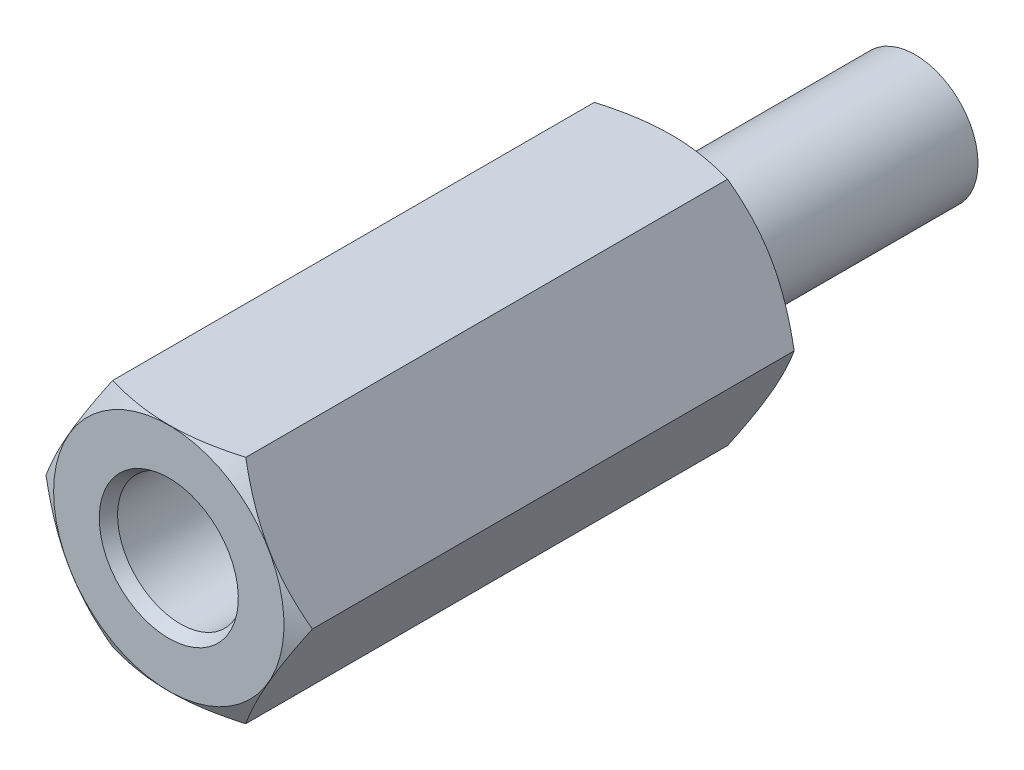
ISO-10303-21;
HEADER;
FILE_DESCRIPTION(('STEP AP214'),'2;1');
FILE_NAME('part.step','',(''),(''),'','','');
FILE_SCHEMA(('AUTOMOTIVE_DESIGN { 1 0 10303 214 1 1 1 1 }'));
ENDSEC;
DATA;
#1=APPLICATION_CONTEXT('core data for automotive mechanical design processes');
#2=APPLICATION_PROTOCOL_DEFINITION('international standard','automotive_design',2000,#1);
#3=PRODUCT_CONTEXT('',#1,'mechanical');
#4=PRODUCT('Part','Part','',(#3));
#5=PRODUCT_RELATED_PRODUCT_CATEGORY('part','',(#4));
#6=PRODUCT_DEFINITION_FORMATION('','',#4);
#7=PRODUCT_DEFINITION_CONTEXT('part definition',#1,'design');
#8=PRODUCT_DEFINITION('design','',#6,#7);
#9=PRODUCT_DEFINITION_SHAPE('','',#8);
#10=(LENGTH_UNIT() NAMED_UNIT(*) SI_UNIT(.MILLI.,.METRE.));
#11=(NAMED_UNIT(*) PLANE_ANGLE_UNIT() SI_UNIT($,.RADIAN.));
#12=(NAMED_UNIT(*) SI_UNIT($,.STERADIAN.) SOLID_ANGLE_UNIT());
#13=UNCERTAINTY_MEASURE_WITH_UNIT(LENGTH_MEASURE(1.E-05),#10,'distance_accuracy_value','');
#14=(GEOMETRIC_REPRESENTATION_CONTEXT(3) GLOBAL_UNCERTAINTY_ASSIGNED_CONTEXT((#13)) GLOBAL_UNIT_ASSIGNED_CONTEXT((#10,
#11,#12)) REPRESENTATION_CONTEXT('',''));
#15=CARTESIAN_POINT('',(0.,0.,0.));
#16=DIRECTION('',(0.,0.,1.));
#17=DIRECTION('',(1.,0.,0.));
#18=AXIS2_PLACEMENT_3D('',#15,#16,#17);
#19=CARTESIAN_POINT('',(0.,0.,5.99999999997181));
#20=DIRECTION('',(0.,0.,1.));
#21=DIRECTION('',(1.,0.,0.));
#22=AXIS2_PLACEMENT_3D('',#19,#20,#21);
#23=CONICAL_SURFACE('',#22,1.50000000002137,1.0471975511292);
#24=CARTESIAN_POINT('',(0.,0.,6.));
#25=DIRECTION('',(0.,0.,-1.));
#26=DIRECTION('',(-1.,0.,0.));
#27=AXIS2_PLACEMENT_3D('',#24,#25,#26);
#28=CIRCLE('',#27,1.5);
#29=CARTESIAN_POINT('',(-1.5,0.,6.));
#30=VERTEX_POINT('',#29);
#31=EDGE_CURVE('E245',#30,#30,#28,.F.);
#32=ORIENTED_EDGE('',*,*,#31,.T.);
#33=EDGE_LOOP('',(#32));
#34=FACE_BOUND('',#33,.T.);
#35=CARTESIAN_POINT('',(-1.13686837721616E-10,0.,5.13397459610587));
#36=VERTEX_POINT('',#35);
#37=VERTEX_LOOP('',#36);
#38=FACE_BOUND('',#37,.T.);
#39=ADVANCED_FACE('F16',(#34,#38),#23,.F.);
#40=CARTESIAN_POINT('',(0.,0.,11.722871870789));
#41=DIRECTION('',(0.,0.,-1.));
#42=DIRECTION('',(-1.,0.,0.));
#43=AXIS2_PLACEMENT_3D('',#40,#41,#42);
#44=CYLINDRICAL_SURFACE('',#43,1.5);
#45=ORIENTED_EDGE('',*,*,#31,.F.);
#46=EDGE_LOOP('',(#45));
#47=FACE_BOUND('',#46,.T.);
#48=CARTESIAN_POINT('',(0.,0.,11.722871870802));
#49=DIRECTION('',(0.,0.,1.));
#50=DIRECTION('',(1.,0.,0.));
#51=AXIS2_PLACEMENT_3D('',#48,#49,#50);
#52=CIRCLE('',#51,1.50000000007822);
#53=CARTESIAN_POINT('',(1.50000000007822,0.,11.722871870802));
#54=VERTEX_POINT('',#53);
#55=EDGE_CURVE('E248',#54,#54,#52,.T.);
#56=ORIENTED_EDGE('',*,*,#55,.T.);
#57=EDGE_LOOP('',(#56));
#58=FACE_BOUND('',#57,.T.);
#59=ADVANCED_FACE('F75',(#47,#58),#44,.F.);
#60=CARTESIAN_POINT('',(0.,0.,11.9999999998299));
#61=DIRECTION('',(0.,0.,1.));
#62=DIRECTION('',(0.,-1.,0.));
#63=AXIS2_PLACEMENT_3D('',#60,#61,#62);
#64=CONICAL_SURFACE('',#63,1.65999999995847,0.523598775560334);
#65=ORIENTED_EDGE('',*,*,#55,.F.);
#66=EDGE_LOOP('',(#65));
#67=FACE_BOUND('',#66,.T.);
#68=CARTESIAN_POINT('',(0.,0.,11.9999999998868));
#69=DIRECTION('',(0.,0.,1.));
#70=DIRECTION('',(0.,-1.,0.));
#71=AXIS2_PLACEMENT_3D('',#68,#69,#70);
#72=CIRCLE('',#71,1.65999999999129);
#73=CARTESIAN_POINT('',(0.,-1.65999999999129,11.9999999998868));
#74=VERTEX_POINT('',#73);
#75=EDGE_CURVE('E19',#74,#74,#72,.F.);
#76=ORIENTED_EDGE('',*,*,#75,.F.);
#77=EDGE_LOOP('',(#76));
#78=FACE_BOUND('',#77,.T.);
#79=ADVANCED_FACE('F81',(#67,#78),#64,.F.);
#80=CARTESIAN_POINT('',(0.,0.,12.));
#81=DIRECTION('',(0.,0.,1.));
#82=DIRECTION('',(1.,0.,0.));
#83=AXIS2_PLACEMENT_3D('',#80,#81,#82);
#84=PLANE('',#83);
#85=ORIENTED_EDGE('',*,*,#75,.T.);
#86=EDGE_LOOP('',(#85));
#87=FACE_BOUND('',#86,.T.);
#88=CARTESIAN_POINT('',(0.,0.,12.0000000000005));
#89=DIRECTION('',(0.,0.,-1.));
#90=DIRECTION('',(-1.,0.,0.));
#91=AXIS2_PLACEMENT_3D('',#88,#89,#90);
#92=CIRCLE('',#91,2.74999999999181);
#93=CARTESIAN_POINT('',(-2.74999999999181,0.,12.0000000000005));
#94=VERTEX_POINT('',#93);
#95=EDGE_CURVE('E292',#94,#94,#92,.T.);
#96=ORIENTED_EDGE('',*,*,#95,.F.);
#97=EDGE_LOOP('',(#96));
#98=FACE_BOUND('',#97,.T.);
#99=ADVANCED_FACE('F180',(#87,#98),#84,.T.);
#100=CARTESIAN_POINT('',(0.,0.,11.7502498205226));
#101=DIRECTION('',(0.,0.,-1.));
#102=DIRECTION('',(-1.,0.,0.));
#103=AXIS2_PLACEMENT_3D('',#100,#101,#102);
#104=CONICAL_SURFACE('',#103,3.18258000004334,1.0471975511931);
#105=ORIENTED_EDGE('',*,*,#95,.T.);
#106=EDGE_LOOP('',(#105));
#107=FACE_BOUND('',#106,.T.);
#108=CARTESIAN_POINT('',(-1.59000000000081,2.7539607840336,11.7517393842424));
#109=CARTESIAN_POINT('',(-1.6598708706135,2.63294088616341,11.7920910440021));
#110=CARTESIAN_POINT('',(-1.73034486558733,2.51087634625645,11.828788766705));
#111=CARTESIAN_POINT('',(-1.8725130656166,2.26463380058525,11.8928435394925));
#112=CARTESIAN_POINT('',(-1.94420979590354,2.14045142099178,11.9201779318999));
#113=CARTESIAN_POINT('',(-2.08671475483976,1.89362559178385,11.9627258843608));
#114=CARTESIAN_POINT('',(-2.1575010634166,1.77102010884858,11.9782226576371));
#115=CARTESIAN_POINT('',(-2.299406579769,1.52523254465205,11.9967191112558));
#116=CARTESIAN_POINT('',(-2.37052527211051,1.40205135614876,11.9997341119358));
#117=CARTESIAN_POINT('',(-2.50340291932097,1.17190051999014,11.9934458608386));
#118=CARTESIAN_POINT('',(-2.56518181356342,1.06489633632685,11.9856865831297));
#119=CARTESIAN_POINT('',(-2.68833713270422,0.851585066352739,11.9610991999038));
#120=CARTESIAN_POINT('',(-2.74971313195913,0.745278717277973,11.9442627036052));
#121=CARTESIAN_POINT('',(-2.8731221626718,0.531528005970905,11.9021747215607));
#122=CARTESIAN_POINT('',(-2.93513958293056,0.424110683128436,11.8767449108493));
#123=CARTESIAN_POINT('',(-3.05824970115422,0.210877703439366,11.8190299913591));
#124=CARTESIAN_POINT('',(-3.11934397508537,0.105059316939125,11.7867584345848));
#125=CARTESIAN_POINT('',(-3.18,1.88357274513719E-12,11.7517393842422));
#126=B_SPLINE_CURVE_WITH_KNOTS('',3,(#108,#109,#110,#111,#112,#113,#114,#115,#116,#117,#118,
#119,#120,#121,#122,#123,#124,#125),.UNSPECIFIED.,.F.,.F.,(4,2,2,2,2,2,2,2,4),(0.,
0.43652483186984,0.874098639021207,1.3008438498636,1.72706511088042,2.09811573984899,
2.469509949424,2.84913990286461,3.22802480296586),.UNSPECIFIED.);
#127=CARTESIAN_POINT('',(-1.5899999999996,2.7539607840343,11.7517393842424));
#128=VERTEX_POINT('',#127);
#129=CARTESIAN_POINT('',(-3.17999999999971,4.45101924340833E-13,11.7517393842424));
#130=VERTEX_POINT('',#129);
#131=EDGE_CURVE('E166',#128,#130,#126,.T.);
#132=ORIENTED_EDGE('',*,*,#131,.T.);
#133=CARTESIAN_POINT('',(-3.17999999999943,-9.93263192367112E-13,11.7517393842425));
#134=CARTESIAN_POINT('',(-3.11012912938674,-0.121019897871171,11.7920910440022));
#135=CARTESIAN_POINT('',(-3.03965513441292,-0.243084437778119,11.8287887667052));
#136=CARTESIAN_POINT('',(-2.89748693438367,-0.489326983449281,11.8928435394927));
#137=CARTESIAN_POINT('',(-2.82579020409674,-0.613509363042745,11.9201779319001));
#138=CARTESIAN_POINT('',(-2.68328524516053,-0.860335192250644,11.9627258843611));
#139=CARTESIAN_POINT('',(-2.6124989365837,-0.982940675185901,11.9782226576375));
#140=CARTESIAN_POINT('',(-2.47059342023131,-1.22872823938241,11.9967191112563));
#141=CARTESIAN_POINT('',(-2.39947472788981,-1.35190942788568,11.9997341119363));
#142=CARTESIAN_POINT('',(-2.26659708067932,-1.58206026404435,11.9934458608392));
#143=CARTESIAN_POINT('',(-2.20481818643684,-1.6890644477077,11.9856865831303));
#144=CARTESIAN_POINT('',(-2.08166286729598,-1.90237571768192,11.9610991999045));
#145=CARTESIAN_POINT('',(-2.02028686804103,-2.00868206675674,11.9442627036058));
#146=CARTESIAN_POINT('',(-1.89687783732829,-2.22243277806393,11.9021747215614));
#147=CARTESIAN_POINT('',(-1.8348604170695,-2.32985010090646,11.87674491085));
#148=CARTESIAN_POINT('',(-1.71175029884578,-2.54308308059564,11.8190299913598));
#149=CARTESIAN_POINT('',(-1.65065602491459,-2.64890146709594,11.7867584345855));
#150=CARTESIAN_POINT('',(-1.58999999999993,-2.75396078403324,11.7517393842428));
#151=B_SPLINE_CURVE_WITH_KNOTS('',3,(#133,#134,#135,#136,#137,#138,#139,#140,#141,#142,#143,
#144,#145,#146,#147,#148,#149,#150),.UNSPECIFIED.,.F.,.F.,(4,2,2,2,2,2,2,2,4),(0.,
0.436524831869811,0.874098639021153,1.30084384986351,1.7270651108803,2.09811573984906,
2.46950994942426,2.84913990286507,3.22802480296652),.UNSPECIFIED.);
#152=CARTESIAN_POINT('',(-1.58999999999893,-2.75396078403412,11.7517393842427));
#153=VERTEX_POINT('',#152);
#154=EDGE_CURVE('E156',#130,#153,#151,.T.);
#155=ORIENTED_EDGE('',*,*,#154,.T.);
#156=CARTESIAN_POINT('',(-1.58999999999793,-2.753960784035,11.7517393842425));
#157=CARTESIAN_POINT('',(-1.45025825877261,-2.753960784035,11.7920910440022));
#158=CARTESIAN_POINT('',(-1.30931026882502,-2.753960784035,11.8287887667051));
#159=CARTESIAN_POINT('',(-1.0249738687666,-2.753960784035,11.8928435394926));
#160=CARTESIAN_POINT('',(-0.881580408192781,-2.753960784035,11.9201779319));
#161=CARTESIAN_POINT('',(-0.596570490320465,-2.753960784035,11.9627258843609));
#162=CARTESIAN_POINT('',(-0.454997873166852,-2.753960784035,11.9782226576371));
#163=CARTESIAN_POINT('',(-0.171186840462178,-2.753960784035,11.9967191112559));
#164=CARTESIAN_POINT('',(-0.0289494557792292,-2.753960784035,11.9997341119358));
#165=CARTESIAN_POINT('',(0.236805838641543,-2.753960784035,11.9934458608386));
#166=CARTESIAN_POINT('',(0.360363627126348,-2.753960784035,11.9856865831298));
#167=CARTESIAN_POINT('',(0.606674265407746,-2.753960784035,11.9610991999039));
#168=CARTESIAN_POINT('',(0.729426263917479,-2.753960784035,11.9442627036052));
#169=CARTESIAN_POINT('',(0.97624432534263,-2.753960784035,11.9021747215607));
#170=CARTESIAN_POINT('',(1.10027916586005,-2.753960784035,11.8767449108494));
#171=CARTESIAN_POINT('',(1.34649940230717,-2.753960784035,11.8190299913592));
#172=CARTESIAN_POINT('',(1.46868795016939,-2.753960784035,11.786758434585));
#173=CARTESIAN_POINT('',(1.58999999999855,-2.753960784035,11.7517393842424));
#174=B_SPLINE_CURVE_WITH_KNOTS('',3,(#156,#157,#158,#159,#160,#161,#162,#163,#164,#165,#166,
#167,#168,#169,#170,#171,#172,#173),.UNSPECIFIED.,.F.,.F.,(4,2,2,2,2,2,2,2,4),(0.,
0.436524831869808,0.874098639021144,1.30084384986351,1.7270651108803,2.09811573984873,
2.46950994942359,2.84913990286404,3.22802480296514),.UNSPECIFIED.);
#175=CARTESIAN_POINT('',(1.58999999999976,-2.75396078403416,11.7517393842424));
#176=VERTEX_POINT('',#175);
#177=EDGE_CURVE('E70',#153,#176,#174,.T.);
#178=ORIENTED_EDGE('',*,*,#177,.T.);
#179=CARTESIAN_POINT('',(1.59000000000097,-2.75396078403333,11.7517393842425));
#180=CARTESIAN_POINT('',(1.65987087061185,-2.63294088616626,11.7920910440011));
#181=CARTESIAN_POINT('',(1.73034486558385,-2.51087634626247,11.8287887667032));
#182=CARTESIAN_POINT('',(1.87251306560918,-2.2646338005981,11.8928435394894));
#183=CARTESIAN_POINT('',(1.944209795894,-2.14045142100829,11.9201779318964));
#184=CARTESIAN_POINT('',(2.0867147548299,-1.89362559180093,11.9627258843585));
#185=CARTESIAN_POINT('',(2.15750106340858,-1.77102010886247,11.9782226576357));
#186=CARTESIAN_POINT('',(2.299406579765,-1.52523254465898,11.9967191112556));
#187=CARTESIAN_POINT('',(2.37052527210869,-1.40205135615192,11.9997341119357));
#188=CARTESIAN_POINT('',(2.50340291885235,-1.17190052080182,11.9934458608609));
#189=CARTESIAN_POINT('',(2.56518181262683,-1.06489633794907,11.9856865832478));
#190=CARTESIAN_POINT('',(2.68833713083946,-0.851585069582595,11.9610992003451));
#191=CARTESIAN_POINT('',(2.7497131296342,-0.745278721304879,11.9442627042743));
#192=CARTESIAN_POINT('',(2.87312215941586,-0.531528011610361,11.9021747227978));
#193=CARTESIAN_POINT('',(2.93513957920425,-0.4241106895826,11.8767449124308));
#194=CARTESIAN_POINT('',(3.05824969650427,-0.210877711493303,11.8190299937042));
#195=CARTESIAN_POINT('',(3.11934396998211,-0.105059325778235,11.7867584373487));
#196=CARTESIAN_POINT('',(3.17999999444977,-9.61515524074901E-09,11.7517393874466));
#197=B_SPLINE_CURVE_WITH_KNOTS('',3,(#179,#180,#181,#182,#183,#184,#185,#186,#187,#188,#189,
#190,#191,#192,#193,#194,#195,#196),.UNSPECIFIED.,.F.,.F.,(4,2,2,2,2,2,2,2,4),(0.,
0.436524831858587,0.874098638997259,1.30084384985106,1.72706511088033,2.0981157370371,
2.46950994378989,2.84913989426173,3.22802479141682),.UNSPECIFIED.);
#198=CARTESIAN_POINT('',(3.17999999722489,-4.80757742682424E-09,11.7517393858444));
#199=VERTEX_POINT('',#198);
#200=EDGE_CURVE('E186',#176,#199,#197,.T.);
#201=ORIENTED_EDGE('',*,*,#200,.T.);
#202=CARTESIAN_POINT('',(3.17999999444915,9.61436255658718E-09,11.751739387447));
#203=CARTESIAN_POINT('',(3.11012912392832,0.121019907325435,11.7920910469445));
#204=CARTESIAN_POINT('',(3.03965512904694,0.243084447072275,11.8287887693687));
#205=CARTESIAN_POINT('',(2.89748692921154,0.489326992407661,11.8928435415773));
#206=CARTESIAN_POINT('',(2.82579019902609,0.613509371825361,11.9201779336848));
#207=CARTESIAN_POINT('',(2.68328524029266,0.860335200682049,11.962725885551));
#208=CARTESIAN_POINT('',(2.61249893181676,0.98294068344249,11.9782226585312));
#209=CARTESIAN_POINT('',(2.47059341567804,1.22872824726891,11.9967191115783));
#210=CARTESIAN_POINT('',(2.39947472344926,1.35190943557695,11.9997341119825));
#211=CARTESIAN_POINT('',(2.26659707671009,1.58206027091927,11.9934458604276));
#212=CARTESIAN_POINT('',(2.20481818282432,1.68906445396476,11.9856865825697));
#213=CARTESIAN_POINT('',(2.08166286439805,1.90237572270128,11.9610991991651));
#214=CARTESIAN_POINT('',(2.02028686550097,2.00868207115625,11.944262702837));
#215=CARTESIAN_POINT('',(1.8968778355167,2.2224327812017,11.9021747208437));
#216=CARTESIAN_POINT('',(1.83486041562823,2.32985010340281,11.8767449102168));
#217=CARTESIAN_POINT('',(1.71175029813376,2.5430830818289,11.8190299909836));
#218=CARTESIAN_POINT('',(1.65065602456152,2.64890146770747,11.7867584343814));
#219=CARTESIAN_POINT('',(1.59000000000017,2.75396078403283,11.751739384243));
#220=B_SPLINE_CURVE_WITH_KNOTS('',3,(#202,#203,#204,#205,#206,#207,#208,#209,#210,#211,#212,
#213,#214,#215,#216,#217,#218,#219),.UNSPECIFIED.,.F.,.F.,(4,2,2,2,2,2,2,2,4),(0.,
0.436524831121008,0.874098637504175,1.3008438476477,1.7270651079729,2.09811573484087,
2.46950994230716,2.84913989352475,3.22802479141719),.UNSPECIFIED.);
#221=CARTESIAN_POINT('',(1.58999999999917,2.75396078403391,11.7517393842427));
#222=VERTEX_POINT('',#221);
#223=EDGE_CURVE('E193',#199,#222,#220,.T.);
#224=ORIENTED_EDGE('',*,*,#223,.T.);
#225=CARTESIAN_POINT('',(1.58999999999818,2.753960784035,11.7517393842425));
#226=CARTESIAN_POINT('',(1.45025825877285,2.753960784035,11.7920910440021));
#227=CARTESIAN_POINT('',(1.30931026882525,2.753960784035,11.8287887667051));
#228=CARTESIAN_POINT('',(1.02497386876682,2.753960784035,11.8928435394925));
#229=CARTESIAN_POINT('',(0.881580408193001,2.753960784035,11.9201779318999));
#230=CARTESIAN_POINT('',(0.596570490320677,2.753960784035,11.9627258843608));
#231=CARTESIAN_POINT('',(0.454997873167059,2.753960784035,11.9782226576371));
#232=CARTESIAN_POINT('',(0.171186840462375,2.753960784035,11.9967191112559));
#233=CARTESIAN_POINT('',(0.0289494557794218,2.753960784035,11.9997341119358));
#234=CARTESIAN_POINT('',(-0.236805838641358,2.753960784035,11.9934458608386));
#235=CARTESIAN_POINT('',(-0.360363627126164,2.753960784035,11.9856865831298));
#236=CARTESIAN_POINT('',(-0.606674265407567,2.753960784035,11.9610991999039));
#237=CARTESIAN_POINT('',(-0.729426263917301,2.753960784035,11.9442627036052));
#238=CARTESIAN_POINT('',(-0.976244325342458,2.753960784035,11.9021747215608));
#239=CARTESIAN_POINT('',(-1.10027916585988,2.753960784035,11.8767449108494));
#240=CARTESIAN_POINT('',(-1.346499402307,2.753960784035,11.8190299913593));
#241=CARTESIAN_POINT('',(-1.46868795016923,2.753960784035,11.786758434585));
#242=CARTESIAN_POINT('',(-1.58999999999839,2.753960784035,11.7517393842424));
#243=B_SPLINE_CURVE_WITH_KNOTS('',3,(#225,#226,#227,#228,#229,#230,#231,#232,#233,#234,#235,
#236,#237,#238,#239,#240,#241,#242),.UNSPECIFIED.,.F.,.F.,(4,2,2,2,2,2,2,2,4),(0.,
0.436524831869825,0.874098639021177,1.30084384986355,1.72706511088036,2.0981157398488,
2.46950994942366,2.84913990286412,3.22802480296522),.UNSPECIFIED.);
#244=EDGE_CURVE('E198',#222,#128,#243,.T.);
#245=ORIENTED_EDGE('',*,*,#244,.T.);
#246=EDGE_LOOP('',(#132,#155,#178,#201,#224,#245));
#247=FACE_BOUND('',#246,.T.);
#248=ADVANCED_FACE('F175',(#107,#247),#104,.T.);
#249=CARTESIAN_POINT('',(1.59,-2.753960784035,-10.));
#250=DIRECTION('',(-0.866025403784329,0.50000000000019,0.));
#251=DIRECTION('',(-0.50000000000019,-0.866025403784329,0.));
#252=AXIS2_PLACEMENT_3D('',#249,#250,#251);
#253=PLANE('',#252);
#254=ORIENTED_EDGE('',*,*,#200,.F.);
#255=DIRECTION('',(0.,0.,1.));
#256=VECTOR('',#255,1.);
#257=CARTESIAN_POINT('',(1.59,-2.753960784035,-10.));
#258=LINE('',#257,#256);
#259=CARTESIAN_POINT('',(1.58999995668477,-2.753960784035,0.24826060327207));
#260=VERTEX_POINT('',#259);
#261=EDGE_CURVE('E165',#176,#260,#258,.F.);
#262=ORIENTED_EDGE('',*,*,#261,.T.);
#263=CARTESIAN_POINT('',(3.17999997396859,-1.38043565660934E-08,0.24826061880916));
#264=CARTESIAN_POINT('',(3.11012911256683,-0.121019915769744,0.207908953215328));
#265=CARTESIAN_POINT('',(3.03965512121165,-0.243084457633775,0.171211228361298));
#266=CARTESIAN_POINT('',(2.89748692355303,-0.489327005229111,0.107156454645271));
#267=CARTESIAN_POINT('',(2.82579019200708,-0.613509384783673,0.0798220634610996));
#268=CARTESIAN_POINT('',(2.68328523199397,-0.860335214278304,0.0372741127463411));
#269=CARTESIAN_POINT('',(2.61249892356692,-0.982940697525742,0.0217773399991891));
#270=CARTESIAN_POINT('',(2.47059340717891,-1.22872826219922,0.00328088774374463));
#271=CARTESIAN_POINT('',(2.39947471465223,-1.35190945086776,0.000265887901627008));
#272=CARTESIAN_POINT('',(2.26659706726036,-1.58206028724326,0.0065541405188458));
#273=CARTESIAN_POINT('',(2.20481817300529,-1.68906447096149,0.0143134189096583));
#274=CARTESIAN_POINT('',(2.081662853854,-1.90237574097821,0.0389008034590945));
#275=CARTESIAN_POINT('',(2.02028685460111,-2.00868209004078,0.0557373003974788));
#276=CARTESIAN_POINT('',(1.89687782385849,-2.22243280139259,0.0978252836647863));
#277=CARTESIAN_POINT('',(1.83486040356875,-2.32985012429052,0.123255094964128));
#278=CARTESIAN_POINT('',(1.71175028527326,-2.54308310410762,0.180970015555322));
#279=CARTESIAN_POINT('',(1.65065601130143,-2.64890149068009,0.213241572844589));
#280=CARTESIAN_POINT('',(1.58999998634231,-2.75396080769081,0.248260623661368));
#281=B_SPLINE_CURVE_WITH_KNOTS('',3,(#263,#264,#265,#266,#267,#268,#269,#270,#271,#272,#273,
#274,#275,#276,#277,#278,#279,#280),.UNSPECIFIED.,.F.,.F.,(4,2,2,2,2,2,2,2,4),(0.,
0.436524833133789,0.874098641209254,1.30084385252974,1.7270651141625,2.09811574343271,
2.46950995323602,2.8491399072231,3.22802480796484),.UNSPECIFIED.);
#282=CARTESIAN_POINT('',(3.17999998887964,-3.43587439187712E-13,0.248260609355515));
#283=VERTEX_POINT('',#282);
#284=EDGE_CURVE('E229',#283,#260,#281,.T.);
#285=ORIENTED_EDGE('',*,*,#284,.F.);
#286=DIRECTION('',(0.,0.,1.));
#287=VECTOR('',#286,1.);
#288=CARTESIAN_POINT('',(3.18,0.,-10.));
#289=LINE('',#288,#287);
#290=EDGE_CURVE('E221',#283,#199,#289,.T.);
#291=ORIENTED_EDGE('',*,*,#290,.T.);
#292=EDGE_LOOP('',(#254,#262,#285,#291));
#293=FACE_BOUND('',#292,.T.);
#294=ADVANCED_FACE('F179',(#293),#253,.F.);
#295=CARTESIAN_POINT('',(-1.59,-2.753960784035,-10.));
#296=DIRECTION('',(0.,1.,0.));
#297=DIRECTION('',(-1.,0.,0.));
#298=AXIS2_PLACEMENT_3D('',#295,#296,#297);
#299=PLANE('',#298);
#300=ORIENTED_EDGE('',*,*,#177,.F.);
#301=DIRECTION('',(0.,0.,1.));
#302=VECTOR('',#301,1.);
#303=CARTESIAN_POINT('',(-1.58999999999919,-2.75396078403453,-10.));
#304=LINE('',#303,#302);
#305=CARTESIAN_POINT('',(-1.58999999168347,-2.75396079843777,0.248260620576708));
#306=VERTEX_POINT('',#305);
#307=EDGE_CURVE('E164',#153,#306,#304,.F.);
#308=ORIENTED_EDGE('',*,*,#307,.T.);
#309=CARTESIAN_POINT('',(1.58999991336773,-2.75396078402463,0.248260590774307));
#310=CARTESIAN_POINT('',(1.45025817360475,-2.75396078403128,0.207908933064436));
#311=CARTESIAN_POINT('',(1.30931018512826,-2.753960784034,0.171211212541442));
#312=CARTESIAN_POINT('',(1.02497378815622,-2.753960784036,0.107156444280704));
#313=CARTESIAN_POINT('',(0.881580329198612,-2.75396078403527,0.0798220542172972));
#314=CARTESIAN_POINT('',(0.59657041449505,-2.75396078403474,0.0372741063897442));
#315=CARTESIAN_POINT('',(0.454997798887541,-2.75396078403493,0.0217773354170066));
#316=CARTESIAN_POINT('',(0.171186769454124,-2.75396078403507,0.00328088625075651));
#317=CARTESIAN_POINT('',(0.0289493864959698,-2.75396078403502,0.000265887721638831));
#318=CARTESIAN_POINT('',(-0.236805893284307,-2.75396078403499,0.00655414221770993));
#319=CARTESIAN_POINT('',(-0.360363668898581,-2.753960784035,0.0143134203425945));
#320=CARTESIAN_POINT('',(-0.606674281542169,-2.753960784035,0.0389008024412611));
#321=CARTESIAN_POINT('',(-0.729426267285031,-2.753960784035,0.0557372971921627));
#322=CARTESIAN_POINT('',(-0.976244302811604,-2.753960784035,0.0978252744052341));
#323=CARTESIAN_POINT('',(-1.10027913020865,-2.753960784035,0.123255081770787));
#324=CARTESIAN_POINT('',(-1.34649934086016,-2.753960784035,0.180969993297866));
#325=CARTESIAN_POINT('',(-1.46868787604557,-2.753960784035,0.213241545461235));
#326=CARTESIAN_POINT('',(-1.5899999133854,-2.753960784035,0.248260590772619));
#327=B_SPLINE_CURVE_WITH_KNOTS('',3,(#309,#310,#311,#312,#313,#314,#315,#316,#317,#318,#319,
#320,#321,#322,#323,#324,#325,#326),.UNSPECIFIED.,.F.,.F.,(4,2,2,2,2,2,2,2,4),(0.,
0.436524825940359,0.874098626999616,1.30084383247872,1.72706508819706,2.09811567883118,
2.46950984992722,2.84913976285341,3.22802462272753),.UNSPECIFIED.);
#328=EDGE_CURVE('E110',#260,#306,#327,.T.);
#329=ORIENTED_EDGE('',*,*,#328,.F.);
#330=ORIENTED_EDGE('',*,*,#261,.F.);
#331=EDGE_LOOP('',(#300,#308,#329,#330));
#332=FACE_BOUND('',#331,.T.);
#333=ADVANCED_FACE('F149',(#332),#299,.F.);
#334=CARTESIAN_POINT('',(-3.18,0.,-10.));
#335=DIRECTION('',(0.866025403784329,0.50000000000019,0.));
#336=DIRECTION('',(-0.50000000000019,0.866025403784329,0.));
#337=AXIS2_PLACEMENT_3D('',#334,#335,#336);
#338=PLANE('',#337);
#339=ORIENTED_EDGE('',*,*,#154,.F.);
#340=DIRECTION('',(0.,0.,1.));
#341=VECTOR('',#340,1.);
#342=CARTESIAN_POINT('',(-3.18000000000078,5.31259064517897E-13,-10.));
#343=LINE('',#342,#341);
#344=CARTESIAN_POINT('',(-3.1800000083235,-1.44148499172791E-08,0.248260620581433));
#345=VERTEX_POINT('',#344);
#346=EDGE_CURVE('E204',#130,#345,#343,.F.);
#347=ORIENTED_EDGE('',*,*,#346,.T.);
#348=CARTESIAN_POINT('',(-1.58999995415941,-2.75396078842243,0.248260648043194));
#349=CARTESIAN_POINT('',(-1.65987084500897,-2.63294090357003,0.207908972264785));
#350=CARTESIAN_POINT('',(-1.73034484908037,-2.51087636762512,0.17121124224218));
#351=CARTESIAN_POINT('',(-1.87251305740491,-2.26463382204411,0.107156462730054));
#352=CARTESIAN_POINT('',(-1.94420978686428,-2.14045143856239,0.0798220709214207));
#353=CARTESIAN_POINT('',(-2.08671474668205,-1.89362560404291,0.03727411799042));
#354=CARTESIAN_POINT('',(-2.15750105689917,-1.77102011963709,0.0217773436596175));
#355=CARTESIAN_POINT('',(-2.29940657592097,-1.52523255181265,0.00328088883448239));
#356=CARTESIAN_POINT('',(-2.3705252692927,-1.40205136115223,0.000265888010211152));
#357=CARTESIAN_POINT('',(-2.50340291401488,-1.17190052907007,0.00655413887387524));
#358=CARTESIAN_POINT('',(-2.56518180472514,-1.06489635160404,0.0143134157428545));
#359=CARTESIAN_POINT('',(-2.68833711679517,-0.851585093935437,0.0389007963174684));
#360=CARTESIAN_POINT('',(-2.74971311251183,-0.745278750968252,0.0557372907980576));
#361=CARTESIAN_POINT('',(-2.87312213620413,-0.531528051803749,0.0978252683882638));
#362=CARTESIAN_POINT('',(-2.93513955298304,-0.424110734992869,0.123255076448773));
#363=CARTESIAN_POINT('',(-3.05824966441623,-0.210877767073855,0.180969990117995));
#364=CARTESIAN_POINT('',(-3.11934393503576,-0.105059386313818,0.213241543730247));
#365=CARTESIAN_POINT('',(-3.17999995667977,-7.50328460800952E-08,0.248260590764907));
#366=B_SPLINE_CURVE_WITH_KNOTS('',3,(#348,#349,#350,#351,#352,#353,#354,#355,#356,#357,#358,
#359,#360,#361,#362,#363,#364,#365),.UNSPECIFIED.,.F.,.F.,(4,2,2,2,2,2,2,2,4),(0.,
0.436524840586926,0.874098655771885,1.30084387336796,1.72706514142679,2.098115748969,
2.46950993686252,2.84913986826758,3.22802474675772),.UNSPECIFIED.);
#367=EDGE_CURVE('E138',#306,#345,#366,.T.);
#368=ORIENTED_EDGE('',*,*,#367,.F.);
#369=ORIENTED_EDGE('',*,*,#307,.F.);
#370=EDGE_LOOP('',(#339,#347,#368,#369));
#371=FACE_BOUND('',#370,.T.);
#372=ADVANCED_FACE('F145',(#371),#338,.F.);
#373=CARTESIAN_POINT('',(-1.59,2.753960784035,-10.));
#374=DIRECTION('',(0.866025403784329,-0.50000000000019,0.));
#375=DIRECTION('',(0.50000000000019,0.866025403784329,0.));
#376=AXIS2_PLACEMENT_3D('',#373,#374,#375);
#377=PLANE('',#376);
#378=ORIENTED_EDGE('',*,*,#131,.F.);
#379=DIRECTION('',(0.,0.,1.));
#380=VECTOR('',#379,1.);
#381=CARTESIAN_POINT('',(-1.59,2.753960784035,-10.));
#382=LINE('',#381,#380);
#383=CARTESIAN_POINT('',(-1.59000001664482,2.753960784035,0.248260620581046));
#384=VERTEX_POINT('',#383);
#385=EDGE_CURVE('E203',#128,#384,#382,.F.);
#386=ORIENTED_EDGE('',*,*,#385,.T.);
#387=CARTESIAN_POINT('',(-3.1799999808862,-4.19193074839289E-08,0.248260648057505));
#388=CARTESIAN_POINT('',(-3.11012913167072,0.121019866970665,0.207908972274687));
#389=CARTESIAN_POINT('',(-3.03965514467866,0.243084412777128,0.171211242249771));
#390=CARTESIAN_POINT('',(-2.89748694887573,0.489326965589616,0.107156462734925));
#391=CARTESIAN_POINT('',(-2.82579021480654,0.613509346411201,0.0798220709258835));
#392=CARTESIAN_POINT('',(-2.68328525170972,0.860335179039908,0.0372741179936842));
#393=CARTESIAN_POINT('',(-2.61249894267919,0.982940664131842,0.0217773436620886));
#394=CARTESIAN_POINT('',(-2.47059342451877,1.22872823245582,0.00328088883562489));
#395=CARTESIAN_POINT('',(-2.3994747308237,1.35190942293072,0.000265888010819409));
#396=CARTESIAN_POINT('',(-2.26659708589632,1.58206025490149,0.00655413887373209));
#397=CARTESIAN_POINT('',(-2.20481819525222,1.68906443241161,0.0143134157428034));
#398=CARTESIAN_POINT('',(-2.08166288322785,1.90237569011829,0.0389007963183595));
#399=CARTESIAN_POINT('',(-2.02028688749061,2.00868203307941,0.0557372907997993));
#400=CARTESIAN_POINT('',(-1.89687786377839,2.22243273224426,0.0978252683923716));
#401=CARTESIAN_POINT('',(-1.8348604470006,2.32985004906183,0.123255076454424));
#402=CARTESIAN_POINT('',(-1.71175033556974,2.54308301699406,0.180969990127208));
#403=CARTESIAN_POINT('',(-1.6506560649514,2.64890139776063,0.213241543741478));
#404=CARTESIAN_POINT('',(-1.59000004329744,2.75396070904163,0.248260590778307));
#405=B_SPLINE_CURVE_WITH_KNOTS('',3,(#387,#388,#389,#390,#391,#392,#393,#394,#395,#396,#397,
#398,#399,#400,#401,#402,#403,#404),.UNSPECIFIED.,.F.,.F.,(4,2,2,2,2,2,2,2,4),(0.,
0.436524840590627,0.874098655779164,1.30084387337824,1.7270651414401,2.09811574899757,
2.46950993690637,2.8491398683277,3.22802474683404),.UNSPECIFIED.);
#406=EDGE_CURVE('E133',#345,#384,#405,.T.);
#407=ORIENTED_EDGE('',*,*,#406,.F.);
#408=ORIENTED_EDGE('',*,*,#346,.F.);
#409=EDGE_LOOP('',(#378,#386,#407,#408));
#410=FACE_BOUND('',#409,.T.);
#411=ADVANCED_FACE('F148',(#410),#377,.F.);
#412=CARTESIAN_POINT('',(1.59,2.753960784035,-10.));
#413=DIRECTION('',(0.,-1.,0.));
#414=DIRECTION('',(1.,0.,0.));
#415=AXIS2_PLACEMENT_3D('',#412,#413,#414);
#416=PLANE('',#415);
#417=ORIENTED_EDGE('',*,*,#244,.F.);
#418=DIRECTION('',(0.,0.,1.));
#419=VECTOR('',#418,1.);
#420=CARTESIAN_POINT('',(1.58999999999962,2.75396078403378,-10.));
#421=LINE('',#420,#419);
#422=CARTESIAN_POINT('',(1.58999999167576,2.75396079845113,0.248260620581163));
#423=VERTEX_POINT('',#422);
#424=EDGE_CURVE('E35',#222,#423,#421,.F.);
#425=ORIENTED_EDGE('',*,*,#424,.T.);
#426=CARTESIAN_POINT('',(-1.59000002674907,2.75396074654408,0.248260648043217));
#427=CARTESIAN_POINT('',(-1.45025828667795,2.75396077056994,0.207908972269668));
#428=CARTESIAN_POINT('',(-1.30931029561251,2.75396078042614,0.171211242248727));
#429=CARTESIAN_POINT('',(-1.02497389148458,2.75396078765254,0.107156462737));
#430=CARTESIAN_POINT('',(-0.881580427957533,2.75396078499268,0.0798220709271019));
#431=CARTESIAN_POINT('',(-0.596570505044809,2.75396078310103,0.0372741179941955));
#432=CARTESIAN_POINT('',(-0.454997885797533,2.75396078378603,0.0217773436627423));
#433=CARTESIAN_POINT('',(-0.17118684861633,2.75396078428366,0.00328088883605512));
#434=CARTESIAN_POINT('',(-0.0289494615501706,2.75396078409736,0.000265888010879106));
#435=CARTESIAN_POINT('',(0.236805828101963,2.75396078398072,0.00655413887305777));
#436=CARTESIAN_POINT('',(0.360363609459505,2.75396078402037,0.0143134157418955));
#437=CARTESIAN_POINT('',(0.606674233560255,2.75396078404965,0.038900796317091));
#438=CARTESIAN_POINT('',(0.72942622501733,2.75396078403922,0.0557372907984066));
#439=CARTESIAN_POINT('',(0.976244272428179,2.75396078403068,0.0978252683908277));
#440=CARTESIAN_POINT('',(1.10027910598803,2.75396078403284,0.123255076452847));
#441=CARTESIAN_POINT('',(1.34649932885823,2.75396078403715,0.180969990125639));
#442=CARTESIAN_POINT('',(1.46868787009911,2.7539607840393,0.213241543739947));
#443=CARTESIAN_POINT('',(1.58999991340004,2.753960784035,0.248260590776843));
#444=B_SPLINE_CURVE_WITH_KNOTS('',3,(#426,#427,#428,#429,#430,#431,#432,#433,#434,#435,#436,
#437,#438,#439,#440,#441,#442,#443),.UNSPECIFIED.,.F.,.F.,(4,2,2,2,2,2,2,2,4),(0.,
0.436524840586517,0.874098655771383,1.30084387336757,1.72706514142637,2.09811574898577,
2.46950993689662,2.84913986831964,3.22802474682752),.UNSPECIFIED.);
#445=EDGE_CURVE('E127',#384,#423,#444,.T.);
#446=ORIENTED_EDGE('',*,*,#445,.F.);
#447=ORIENTED_EDGE('',*,*,#385,.F.);
#448=EDGE_LOOP('',(#417,#425,#446,#447));
#449=FACE_BOUND('',#448,.T.);
#450=ADVANCED_FACE('F205',(#449),#416,.F.);
#451=CARTESIAN_POINT('',(3.18,0.,-10.));
#452=DIRECTION('',(-0.866025403784329,-0.50000000000019,0.));
#453=DIRECTION('',(0.50000000000019,-0.866025403784329,0.));
#454=AXIS2_PLACEMENT_3D('',#451,#452,#453);
#455=PLANE('',#454);
#456=ORIENTED_EDGE('',*,*,#223,.F.);
#457=ORIENTED_EDGE('',*,*,#290,.F.);
#458=CARTESIAN_POINT('',(1.58999995415297,2.75396078845778,0.248260648045046));
#459=CARTESIAN_POINT('',(1.6598708450064,2.63294090358316,0.207908972265066));
#460=CARTESIAN_POINT('',(1.73034484908541,2.51087636761873,0.171211242238986));
#461=CARTESIAN_POINT('',(1.87251305742997,2.26463382199839,0.107156462719694));
#462=CARTESIAN_POINT('',(1.94420978690178,2.14045143849682,0.079822070907546));
#463=CARTESIAN_POINT('',(2.08671474672182,1.89362560397463,0.0372741179811551));
#464=CARTESIAN_POINT('',(2.15750105692851,1.77102011958645,0.0217773436549312));
#465=CARTESIAN_POINT('',(2.29940657592782,1.52523255180063,0.00328088883445043));
#466=CARTESIAN_POINT('',(2.37052526928748,1.40205136116122,0.000265888010084223));
#467=CARTESIAN_POINT('',(2.50340291661453,1.17190052456738,0.00655413899679464));
#468=CARTESIAN_POINT('',(2.56518180993611,1.0648963425784,0.0143134163993195));
#469=CARTESIAN_POINT('',(2.68833712718541,0.851585075939,0.0389007987762371));
#470=CARTESIAN_POINT('',(2.74971312546994,0.745278728524148,0.0557372945273281));
#471=CARTESIAN_POINT('',(2.87312215435738,0.5315280203614,0.097825275285907));
#472=CARTESIAN_POINT('',(2.93513957376102,0.424110699004357,0.123255085267245));
#473=CARTESIAN_POINT('',(3.05824969034815,0.210877722158437,0.180970003196119));
#474=CARTESIAN_POINT('',(3.11934396349725,0.105059337017059,0.213241559144651));
#475=CARTESIAN_POINT('',(3.17999998763536,2.14161890743345E-08,0.248260608637126));
#476=B_SPLINE_CURVE_WITH_KNOTS('',3,(#458,#459,#460,#461,#462,#463,#464,#465,#466,#467,#468,
#469,#470,#471,#472,#473,#474,#475),.UNSPECIFIED.,.F.,.F.,(4,2,2,2,2,2,2,2,4),(0.,
0.436524840649592,0.87409865590555,1.30084387343843,1.72706514142809,2.09811576466029,
2.46950996830191,2.84913991627263,3.22802481120222),.UNSPECIFIED.);
#477=EDGE_CURVE('E120',#423,#283,#476,.T.);
#478=ORIENTED_EDGE('',*,*,#477,.F.);
#479=ORIENTED_EDGE('',*,*,#424,.F.);
#480=EDGE_LOOP('',(#456,#457,#478,#479));
#481=FACE_BOUND('',#480,.T.);
#482=ADVANCED_FACE('F208',(#481),#455,.F.);
#483=CARTESIAN_POINT('',(0.,0.,-6.));
#484=DIRECTION('',(0.,0.,1.));
#485=DIRECTION('',(1.,0.,0.));
#486=AXIS2_PLACEMENT_3D('',#483,#484,#485);
#487=PLANE('',#486);
#488=CARTESIAN_POINT('',(0.,0.,-6.00000000001986));
#489=DIRECTION('',(0.,0.,1.));
#490=DIRECTION('',(1.,0.,0.));
#491=AXIS2_PLACEMENT_3D('',#488,#489,#490);
#492=CIRCLE('',#491,1.19000000000824);
#493=CARTESIAN_POINT('',(1.19000000000824,0.,-6.00000000001986));
#494=VERTEX_POINT('',#493);
#495=EDGE_CURVE('E255',#494,#494,#492,.T.);
#496=ORIENTED_EDGE('',*,*,#495,.F.);
#497=EDGE_LOOP('',(#496));
#498=FACE_BOUND('',#497,.T.);
#499=ADVANCED_FACE('F104',(#498),#487,.F.);
#500=CARTESIAN_POINT('',(0.,0.,0.249750179364128));
#501=DIRECTION('',(0.,0.,1.));
#502=DIRECTION('',(1.,0.,0.));
#503=AXIS2_PLACEMENT_3D('',#500,#501,#502);
#504=CONICAL_SURFACE('',#503,3.18257999981597,1.0471975511931);
#505=CARTESIAN_POINT('',(0.,0.,-1.52311431696195E-11));
#506=DIRECTION('',(0.,0.,1.));
#507=DIRECTION('',(1.,0.,0.));
#508=AXIS2_PLACEMENT_3D('',#505,#506,#507);
#509=CIRCLE('',#508,2.74999999993497);
#510=CARTESIAN_POINT('',(2.74999999993497,0.,-1.52311431696195E-11));
#511=VERTEX_POINT('',#510);
#512=EDGE_CURVE('E252',#511,#511,#509,.T.);
#513=ORIENTED_EDGE('',*,*,#512,.T.);
#514=EDGE_LOOP('',(#513));
#515=FACE_BOUND('',#514,.T.);
#516=ORIENTED_EDGE('',*,*,#445,.T.);
#517=ORIENTED_EDGE('',*,*,#477,.T.);
#518=ORIENTED_EDGE('',*,*,#284,.T.);
#519=ORIENTED_EDGE('',*,*,#328,.T.);
#520=ORIENTED_EDGE('',*,*,#367,.T.);
#521=ORIENTED_EDGE('',*,*,#406,.T.);
#522=EDGE_LOOP('',(#516,#517,#518,#519,#520,#521));
#523=FACE_BOUND('',#522,.T.);
#524=ADVANCED_FACE('F99',(#515,#523),#504,.T.);
#525=CARTESIAN_POINT('',(0.,0.,-5.82102141663654));
#526=DIRECTION('',(0.,0.,1.));
#527=DIRECTION('',(1.,0.,0.));
#528=AXIS2_PLACEMENT_3D('',#525,#526,#527);
#529=CONICAL_SURFACE('',#528,1.49999999990769,1.04719755121454);
#530=CARTESIAN_POINT('',(0.,0.,-5.821021416551));
#531=DIRECTION('',(0.,0.,1.));
#532=DIRECTION('',(1.,0.,0.));
#533=AXIS2_PLACEMENT_3D('',#530,#531,#532);
#534=CIRCLE('',#533,1.5);
#535=CARTESIAN_POINT('',(1.5,0.,-5.821021416551));
#536=VERTEX_POINT('',#535);
#537=EDGE_CURVE('E26',#536,#536,#534,.T.);
#538=ORIENTED_EDGE('',*,*,#537,.F.);
#539=EDGE_LOOP('',(#538));
#540=FACE_BOUND('',#539,.T.);
#541=ORIENTED_EDGE('',*,*,#495,.T.);
#542=EDGE_LOOP('',(#541));
#543=FACE_BOUND('',#542,.T.);
#544=ADVANCED_FACE('F92',(#540,#543),#529,.T.);
#545=CARTESIAN_POINT('',(0.,0.,0.));
#546=DIRECTION('',(0.,0.,1.));
#547=DIRECTION('',(1.,0.,0.));
#548=AXIS2_PLACEMENT_3D('',#545,#546,#547);
#549=PLANE('',#548);
#550=ORIENTED_EDGE('',*,*,#512,.F.);
#551=EDGE_LOOP('',(#550));
#552=FACE_BOUND('',#551,.T.);
#553=CARTESIAN_POINT('',(0.,0.,0.));
#554=DIRECTION('',(0.,0.,1.));
#555=DIRECTION('',(1.,0.,0.));
#556=AXIS2_PLACEMENT_3D('',#553,#554,#555);
#557=CIRCLE('',#556,1.5);
#558=CARTESIAN_POINT('',(1.5,0.,0.));
#559=VERTEX_POINT('',#558);
#560=EDGE_CURVE('E10',#559,#559,#557,.F.);
#561=ORIENTED_EDGE('',*,*,#560,.F.);
#562=EDGE_LOOP('',(#561));
#563=FACE_BOUND('',#562,.T.);
#564=ADVANCED_FACE('F86',(#552,#563),#549,.F.);
#565=CARTESIAN_POINT('',(0.,0.,-5.821021416551));
#566=DIRECTION('',(0.,0.,1.));
#567=DIRECTION('',(1.,0.,0.));
#568=AXIS2_PLACEMENT_3D('',#565,#566,#567);
#569=CYLINDRICAL_SURFACE('',#568,1.5);
#570=ORIENTED_EDGE('',*,*,#560,.T.);
#571=EDGE_LOOP('',(#570));
#572=FACE_BOUND('',#571,.T.);
#573=ORIENTED_EDGE('',*,*,#537,.T.);
#574=EDGE_LOOP('',(#573));
#575=FACE_BOUND('',#574,.T.);
#576=ADVANCED_FACE('F84',(#572,#575),#569,.T.);
#577=CLOSED_SHELL('',(#39,#59,#79,#99,#248,#294,#333,#372,#411,#450,#482,#499,#524,#544,#564,#576));
#578=MANIFOLD_SOLID_BREP('B1',#577);
#579=ADVANCED_BREP_SHAPE_REPRESENTATION('',(#18,#578),#14);
#580=SHAPE_DEFINITION_REPRESENTATION(#9,#579);
ENDSEC;
END-ISO-10303-21;
